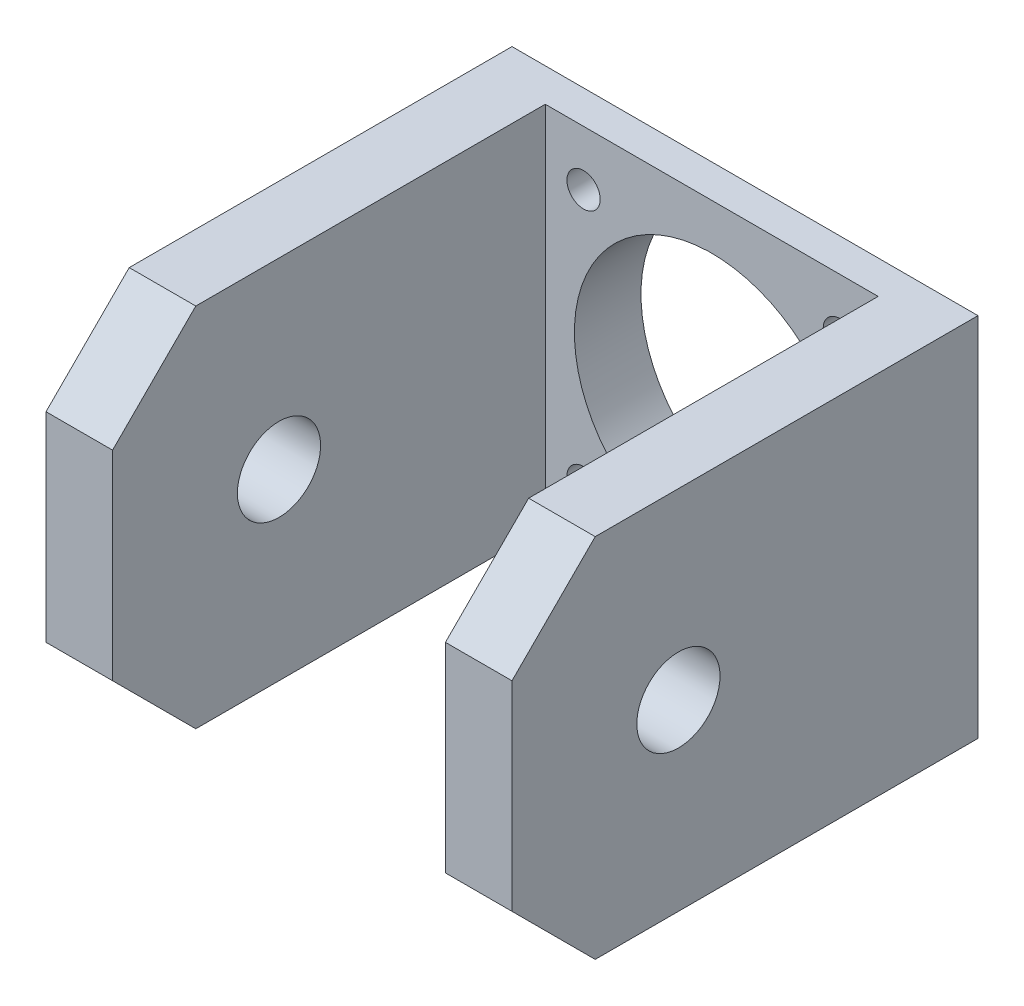
ISO-10303-21;
HEADER;
FILE_DESCRIPTION(('STEP AP214'),'2;1');
FILE_NAME('part.step','',(''),(''),'','','');
FILE_SCHEMA(('AUTOMOTIVE_DESIGN { 1 0 10303 214 1 1 1 1 }'));
ENDSEC;
DATA;
#1=APPLICATION_CONTEXT('core data for automotive mechanical design processes');
#2=APPLICATION_PROTOCOL_DEFINITION('international standard','automotive_design',2000,#1);
#3=PRODUCT_CONTEXT('',#1,'mechanical');
#4=PRODUCT('Part','Part','',(#3));
#5=PRODUCT_RELATED_PRODUCT_CATEGORY('part','',(#4));
#6=PRODUCT_DEFINITION_FORMATION('','',#4);
#7=PRODUCT_DEFINITION_CONTEXT('part definition',#1,'design');
#8=PRODUCT_DEFINITION('design','',#6,#7);
#9=PRODUCT_DEFINITION_SHAPE('','',#8);
#10=(LENGTH_UNIT() NAMED_UNIT(*) SI_UNIT(.MILLI.,.METRE.));
#11=(NAMED_UNIT(*) PLANE_ANGLE_UNIT() SI_UNIT($,.RADIAN.));
#12=(NAMED_UNIT(*) SI_UNIT($,.STERADIAN.) SOLID_ANGLE_UNIT());
#13=UNCERTAINTY_MEASURE_WITH_UNIT(LENGTH_MEASURE(1.E-05),#10,'distance_accuracy_value','');
#14=(GEOMETRIC_REPRESENTATION_CONTEXT(3) GLOBAL_UNCERTAINTY_ASSIGNED_CONTEXT((#13)) GLOBAL_UNIT_ASSIGNED_CONTEXT((#10,
#11,#12)) REPRESENTATION_CONTEXT('',''));
#15=CARTESIAN_POINT('',(0.,0.,0.));
#16=DIRECTION('',(0.,0.,1.));
#17=DIRECTION('',(1.,0.,0.));
#18=AXIS2_PLACEMENT_3D('',#15,#16,#17);
#19=CARTESIAN_POINT('',(4.,0.,0.));
#20=DIRECTION('',(0.,0.,-1.));
#21=DIRECTION('',(-1.,0.,0.));
#22=AXIS2_PLACEMENT_3D('',#19,#20,#21);
#23=PLANE('',#22);
#24=DIRECTION('',(0.,-1.,0.));
#25=VECTOR('',#24,1.);
#26=CARTESIAN_POINT('',(0.,0.,0.));
#27=LINE('',#26,#25);
#28=CARTESIAN_POINT('',(0.,17.,0.));
#29=VERTEX_POINT('',#28);
#30=CARTESIAN_POINT('',(0.,5.00000000000002,0.));
#31=VERTEX_POINT('',#30);
#32=EDGE_CURVE('E171',#29,#31,#27,.T.);
#33=ORIENTED_EDGE('',*,*,#32,.T.);
#34=DIRECTION('',(1.,0.,0.));
#35=VECTOR('',#34,1.);
#36=CARTESIAN_POINT('',(4.,5.00000000000002,0.));
#37=LINE('',#36,#35);
#38=CARTESIAN_POINT('',(4.,5.00000000000002,0.));
#39=VERTEX_POINT('',#38);
#40=EDGE_CURVE('E198',#31,#39,#37,.T.);
#41=ORIENTED_EDGE('',*,*,#40,.T.);
#42=DIRECTION('',(0.,-1.,0.));
#43=VECTOR('',#42,1.);
#44=CARTESIAN_POINT('',(4.,0.,0.));
#45=LINE('',#44,#43);
#46=CARTESIAN_POINT('',(4.,17.,0.));
#47=VERTEX_POINT('',#46);
#48=EDGE_CURVE('E172',#47,#39,#45,.T.);
#49=ORIENTED_EDGE('',*,*,#48,.F.);
#50=DIRECTION('',(-1.,0.,0.));
#51=VECTOR('',#50,1.);
#52=CARTESIAN_POINT('',(4.,17.,0.));
#53=LINE('',#52,#51);
#54=EDGE_CURVE('E195',#47,#29,#53,.T.);
#55=ORIENTED_EDGE('',*,*,#54,.T.);
#56=EDGE_LOOP('',(#33,#41,#49,#55));
#57=FACE_BOUND('',#56,.T.);
#58=ADVANCED_FACE('F34',(#57),#23,.F.);
#59=CARTESIAN_POINT('',(4.,0.,0.));
#60=DIRECTION('',(0.,1.,0.));
#61=DIRECTION('',(0.,0.,1.));
#62=AXIS2_PLACEMENT_3D('',#59,#60,#61);
#63=PLANE('',#62);
#64=DIRECTION('',(0.,0.,1.));
#65=VECTOR('',#64,1.);
#66=CARTESIAN_POINT('',(-24.,0.,-30.));
#67=LINE('',#66,#65);
#68=CARTESIAN_POINT('',(-24.,0.,-28.));
#69=VERTEX_POINT('',#68);
#70=CARTESIAN_POINT('',(-24.,0.,-5.00000000000002));
#71=VERTEX_POINT('',#70);
#72=EDGE_CURVE('E276',#69,#71,#67,.T.);
#73=ORIENTED_EDGE('',*,*,#72,.F.);
#74=DIRECTION('',(1.,0.,0.));
#75=VECTOR('',#74,1.);
#76=CARTESIAN_POINT('',(4.,0.,-28.));
#77=LINE('',#76,#75);
#78=CARTESIAN_POINT('',(4.,0.,-28.));
#79=VERTEX_POINT('',#78);
#80=EDGE_CURVE('E230',#69,#79,#77,.T.);
#81=ORIENTED_EDGE('',*,*,#80,.T.);
#82=DIRECTION('',(0.,0.,-1.));
#83=VECTOR('',#82,1.);
#84=CARTESIAN_POINT('',(4.,0.,0.));
#85=LINE('',#84,#83);
#86=CARTESIAN_POINT('',(4.,0.,-5.));
#87=VERTEX_POINT('',#86);
#88=EDGE_CURVE('E175',#87,#79,#85,.T.);
#89=ORIENTED_EDGE('',*,*,#88,.F.);
#90=DIRECTION('',(-1.,0.,0.));
#91=VECTOR('',#90,1.);
#92=CARTESIAN_POINT('',(4.,0.,-5.));
#93=LINE('',#92,#91);
#94=CARTESIAN_POINT('',(0.,0.,-5.));
#95=VERTEX_POINT('',#94);
#96=EDGE_CURVE('E188',#87,#95,#93,.T.);
#97=ORIENTED_EDGE('',*,*,#96,.T.);
#98=DIRECTION('',(0.,0.,-1.));
#99=VECTOR('',#98,1.);
#100=CARTESIAN_POINT('',(0.,0.,0.));
#101=LINE('',#100,#99);
#102=CARTESIAN_POINT('',(0.,0.,-26.));
#103=VERTEX_POINT('',#102);
#104=EDGE_CURVE('E183',#95,#103,#101,.T.);
#105=ORIENTED_EDGE('',*,*,#104,.T.);
#106=DIRECTION('',(1.,0.,0.));
#107=VECTOR('',#106,1.);
#108=CARTESIAN_POINT('',(-20.,0.,-26.));
#109=LINE('',#108,#107);
#110=CARTESIAN_POINT('',(-20.,0.,-26.));
#111=VERTEX_POINT('',#110);
#112=EDGE_CURVE('E158',#111,#103,#109,.T.);
#113=ORIENTED_EDGE('',*,*,#112,.F.);
#114=DIRECTION('',(0.,0.,1.));
#115=VECTOR('',#114,1.);
#116=CARTESIAN_POINT('',(-20.,0.,-30.));
#117=LINE('',#116,#115);
#118=CARTESIAN_POINT('',(-20.,0.,-5.00000000000002));
#119=VERTEX_POINT('',#118);
#120=EDGE_CURVE('E146',#111,#119,#117,.T.);
#121=ORIENTED_EDGE('',*,*,#120,.T.);
#122=DIRECTION('',(-1.,0.,0.));
#123=VECTOR('',#122,1.);
#124=CARTESIAN_POINT('',(4.,0.,-5.00000000000002));
#125=LINE('',#124,#123);
#126=EDGE_CURVE('E180',#119,#71,#125,.T.);
#127=ORIENTED_EDGE('',*,*,#126,.T.);
#128=EDGE_LOOP('',(#73,#81,#89,#97,#105,#113,#121,#127));
#129=FACE_BOUND('',#128,.T.);
#130=ADVANCED_FACE('F296',(#129),#63,.F.);
#131=CARTESIAN_POINT('',(4.,0.,-30.));
#132=DIRECTION('',(0.,0.,1.));
#133=DIRECTION('',(1.,0.,0.));
#134=AXIS2_PLACEMENT_3D('',#131,#132,#133);
#135=PLANE('',#134);
#136=DIRECTION('',(0.,-1.,0.));
#137=VECTOR('',#136,1.);
#138=CARTESIAN_POINT('',(1.99999999999999,0.,-30.));
#139=LINE('',#138,#137);
#140=CARTESIAN_POINT('',(1.99999999999999,20.,-30.));
#141=VERTEX_POINT('',#140);
#142=CARTESIAN_POINT('',(1.99999999999999,2.00000000000001,-30.));
#143=VERTEX_POINT('',#142);
#144=EDGE_CURVE('E225',#141,#143,#139,.T.);
#145=ORIENTED_EDGE('',*,*,#144,.T.);
#146=DIRECTION('',(-1.,0.,0.));
#147=VECTOR('',#146,1.);
#148=CARTESIAN_POINT('',(4.,2.00000000000001,-30.));
#149=LINE('',#148,#147);
#150=CARTESIAN_POINT('',(-22.,2.00000000000001,-30.));
#151=VERTEX_POINT('',#150);
#152=EDGE_CURVE('E227',#143,#151,#149,.T.);
#153=ORIENTED_EDGE('',*,*,#152,.T.);
#154=DIRECTION('',(0.,1.,0.));
#155=VECTOR('',#154,1.);
#156=CARTESIAN_POINT('',(-22.,22.,-30.));
#157=LINE('',#156,#155);
#158=CARTESIAN_POINT('',(-22.,20.,-30.));
#159=VERTEX_POINT('',#158);
#160=EDGE_CURVE('E221',#151,#159,#157,.T.);
#161=ORIENTED_EDGE('',*,*,#160,.T.);
#162=DIRECTION('',(1.,0.,0.));
#163=VECTOR('',#162,1.);
#164=CARTESIAN_POINT('',(4.,20.,-30.));
#165=LINE('',#164,#163);
#166=EDGE_CURVE('E223',#159,#141,#165,.T.);
#167=ORIENTED_EDGE('',*,*,#166,.T.);
#168=EDGE_LOOP('',(#145,#153,#161,#167));
#169=FACE_BOUND('',#168,.T.);
#170=CARTESIAN_POINT('',(-2.3,3.3,-30.));
#171=DIRECTION('',(0.,0.,-1.));
#172=DIRECTION('',(-1.,0.,0.));
#173=AXIS2_PLACEMENT_3D('',#170,#171,#172);
#174=CIRCLE('',#173,1.);
#175=CARTESIAN_POINT('',(-3.3,3.3,-30.));
#176=VERTEX_POINT('',#175);
#177=EDGE_CURVE('E246',#176,#176,#174,.T.);
#178=ORIENTED_EDGE('',*,*,#177,.F.);
#179=EDGE_LOOP('',(#178));
#180=FACE_BOUND('',#179,.T.);
#181=CARTESIAN_POINT('',(-17.7,3.3,-30.));
#182=DIRECTION('',(0.,0.,-1.));
#183=DIRECTION('',(-1.,0.,0.));
#184=AXIS2_PLACEMENT_3D('',#181,#182,#183);
#185=CIRCLE('',#184,1.);
#186=CARTESIAN_POINT('',(-18.7,3.3,-30.));
#187=VERTEX_POINT('',#186);
#188=EDGE_CURVE('E256',#187,#187,#185,.T.);
#189=ORIENTED_EDGE('',*,*,#188,.F.);
#190=EDGE_LOOP('',(#189));
#191=FACE_BOUND('',#190,.T.);
#192=CARTESIAN_POINT('',(-17.7,18.7,-30.));
#193=DIRECTION('',(0.,0.,-1.));
#194=DIRECTION('',(-1.,0.,0.));
#195=AXIS2_PLACEMENT_3D('',#192,#193,#194);
#196=CIRCLE('',#195,1.);
#197=CARTESIAN_POINT('',(-18.7,18.7,-30.));
#198=VERTEX_POINT('',#197);
#199=EDGE_CURVE('E573',#198,#198,#196,.T.);
#200=ORIENTED_EDGE('',*,*,#199,.F.);
#201=EDGE_LOOP('',(#200));
#202=FACE_BOUND('',#201,.T.);
#203=CARTESIAN_POINT('',(-2.3,18.7,-30.));
#204=DIRECTION('',(0.,0.,-1.));
#205=DIRECTION('',(-1.,0.,0.));
#206=AXIS2_PLACEMENT_3D('',#203,#204,#205);
#207=CIRCLE('',#206,1.);
#208=CARTESIAN_POINT('',(-3.3,18.7,-30.));
#209=VERTEX_POINT('',#208);
#210=EDGE_CURVE('E262',#209,#209,#207,.T.);
#211=ORIENTED_EDGE('',*,*,#210,.F.);
#212=EDGE_LOOP('',(#211));
#213=FACE_BOUND('',#212,.T.);
#214=CARTESIAN_POINT('',(-10.,11.,-30.));
#215=DIRECTION('',(0.,0.,1.));
#216=DIRECTION('',(1.,0.,0.));
#217=AXIS2_PLACEMENT_3D('',#214,#215,#216);
#218=CIRCLE('',#217,8.25);
#219=CARTESIAN_POINT('',(-1.75,11.,-30.));
#220=VERTEX_POINT('',#219);
#221=EDGE_CURVE('E147',#220,#220,#218,.F.);
#222=ORIENTED_EDGE('',*,*,#221,.F.);
#223=EDGE_LOOP('',(#222));
#224=FACE_BOUND('',#223,.T.);
#225=ADVANCED_FACE('F307',(#169,#180,#191,#202,#213,#224),#135,.F.);
#226=CARTESIAN_POINT('',(4.,22.,0.));
#227=DIRECTION('',(0.,-1.,0.));
#228=DIRECTION('',(0.,0.,-1.));
#229=AXIS2_PLACEMENT_3D('',#226,#227,#228);
#230=PLANE('',#229);
#231=DIRECTION('',(0.,0.,1.));
#232=VECTOR('',#231,1.);
#233=CARTESIAN_POINT('',(4.,22.,0.));
#234=LINE('',#233,#232);
#235=CARTESIAN_POINT('',(4.,22.,-28.));
#236=VERTEX_POINT('',#235);
#237=CARTESIAN_POINT('',(4.,22.,-5.00000000000001));
#238=VERTEX_POINT('',#237);
#239=EDGE_CURVE('E178',#236,#238,#234,.T.);
#240=ORIENTED_EDGE('',*,*,#239,.F.);
#241=DIRECTION('',(-1.,0.,0.));
#242=VECTOR('',#241,1.);
#243=CARTESIAN_POINT('',(4.,22.,-28.));
#244=LINE('',#243,#242);
#245=CARTESIAN_POINT('',(-24.,22.,-28.));
#246=VERTEX_POINT('',#245);
#247=EDGE_CURVE('E43',#236,#246,#244,.T.);
#248=ORIENTED_EDGE('',*,*,#247,.T.);
#249=DIRECTION('',(0.,0.,-1.));
#250=VECTOR('',#249,1.);
#251=CARTESIAN_POINT('',(-24.,22.,0.));
#252=LINE('',#251,#250);
#253=CARTESIAN_POINT('',(-24.,22.,-5.));
#254=VERTEX_POINT('',#253);
#255=EDGE_CURVE('E274',#254,#246,#252,.T.);
#256=ORIENTED_EDGE('',*,*,#255,.F.);
#257=DIRECTION('',(1.,0.,0.));
#258=VECTOR('',#257,1.);
#259=CARTESIAN_POINT('',(4.,22.,-5.));
#260=LINE('',#259,#258);
#261=CARTESIAN_POINT('',(-20.,22.,-5.));
#262=VERTEX_POINT('',#261);
#263=EDGE_CURVE('E143',#254,#262,#260,.T.);
#264=ORIENTED_EDGE('',*,*,#263,.T.);
#265=DIRECTION('',(0.,0.,-1.));
#266=VECTOR('',#265,1.);
#267=CARTESIAN_POINT('',(-20.,22.,0.));
#268=LINE('',#267,#266);
#269=CARTESIAN_POINT('',(-20.,22.,-26.));
#270=VERTEX_POINT('',#269);
#271=EDGE_CURVE('E137',#262,#270,#268,.T.);
#272=ORIENTED_EDGE('',*,*,#271,.T.);
#273=DIRECTION('',(1.,0.,0.));
#274=VECTOR('',#273,1.);
#275=CARTESIAN_POINT('',(-20.,22.,-26.));
#276=LINE('',#275,#274);
#277=CARTESIAN_POINT('',(0.,22.,-26.));
#278=VERTEX_POINT('',#277);
#279=EDGE_CURVE('E141',#270,#278,#276,.T.);
#280=ORIENTED_EDGE('',*,*,#279,.T.);
#281=DIRECTION('',(0.,0.,1.));
#282=VECTOR('',#281,1.);
#283=CARTESIAN_POINT('',(0.,22.,0.));
#284=LINE('',#283,#282);
#285=CARTESIAN_POINT('',(0.,22.,-5.00000000000001));
#286=VERTEX_POINT('',#285);
#287=EDGE_CURVE('E176',#278,#286,#284,.T.);
#288=ORIENTED_EDGE('',*,*,#287,.T.);
#289=DIRECTION('',(1.,0.,0.));
#290=VECTOR('',#289,1.);
#291=CARTESIAN_POINT('',(4.,22.,-5.00000000000001));
#292=LINE('',#291,#290);
#293=EDGE_CURVE('E218',#286,#238,#292,.T.);
#294=ORIENTED_EDGE('',*,*,#293,.T.);
#295=EDGE_LOOP('',(#240,#248,#256,#264,#272,#280,#288,#294));
#296=FACE_BOUND('',#295,.T.);
#297=ADVANCED_FACE('F139',(#296),#230,.F.);
#298=CARTESIAN_POINT('',(4.,0.,0.));
#299=DIRECTION('',(-1.,0.,0.));
#300=DIRECTION('',(0.,0.,1.));
#301=AXIS2_PLACEMENT_3D('',#298,#299,#300);
#302=PLANE('',#301);
#303=CARTESIAN_POINT('',(4.,11.,-10.));
#304=DIRECTION('',(1.,0.,0.));
#305=DIRECTION('',(0.,0.,-1.));
#306=AXIS2_PLACEMENT_3D('',#303,#304,#305);
#307=CIRCLE('',#306,2.5);
#308=CARTESIAN_POINT('',(4.,11.,-12.5));
#309=VERTEX_POINT('',#308);
#310=EDGE_CURVE('E601',#309,#309,#307,.T.);
#311=ORIENTED_EDGE('',*,*,#310,.F.);
#312=EDGE_LOOP('',(#311));
#313=FACE_BOUND('',#312,.T.);
#314=ORIENTED_EDGE('',*,*,#88,.T.);
#315=DIRECTION('',(0.,1.,0.));
#316=VECTOR('',#315,1.);
#317=CARTESIAN_POINT('',(4.,0.,-28.));
#318=LINE('',#317,#316);
#319=EDGE_CURVE('E58',#79,#236,#318,.T.);
#320=ORIENTED_EDGE('',*,*,#319,.T.);
#321=ORIENTED_EDGE('',*,*,#239,.T.);
#322=DIRECTION('',(0.,0.707106781186546,-0.707106781186549));
#323=VECTOR('',#322,1.);
#324=CARTESIAN_POINT('',(4.,17.,0.));
#325=LINE('',#324,#323);
#326=EDGE_CURVE('E200',#238,#47,#325,.F.);
#327=ORIENTED_EDGE('',*,*,#326,.T.);
#328=ORIENTED_EDGE('',*,*,#48,.T.);
#329=DIRECTION('',(0.,0.707106781186549,0.707106781186546));
#330=VECTOR('',#329,1.);
#331=CARTESIAN_POINT('',(4.,0.,-5.));
#332=LINE('',#331,#330);
#333=EDGE_CURVE('E202',#39,#87,#332,.F.);
#334=ORIENTED_EDGE('',*,*,#333,.T.);
#335=EDGE_LOOP('',(#314,#320,#321,#327,#328,#334));
#336=FACE_BOUND('',#335,.T.);
#337=ADVANCED_FACE('F385',(#313,#336),#302,.F.);
#338=CARTESIAN_POINT('',(0.,0.,0.));
#339=DIRECTION('',(-1.,0.,0.));
#340=DIRECTION('',(0.,0.,1.));
#341=AXIS2_PLACEMENT_3D('',#338,#339,#340);
#342=PLANE('',#341);
#343=CARTESIAN_POINT('',(0.,11.,-10.));
#344=DIRECTION('',(-1.,0.,0.));
#345=DIRECTION('',(0.,0.,1.));
#346=AXIS2_PLACEMENT_3D('',#343,#344,#345);
#347=CIRCLE('',#346,2.5);
#348=CARTESIAN_POINT('',(0.,11.,-7.5));
#349=VERTEX_POINT('',#348);
#350=EDGE_CURVE('E238',#349,#349,#347,.T.);
#351=ORIENTED_EDGE('',*,*,#350,.F.);
#352=EDGE_LOOP('',(#351));
#353=FACE_BOUND('',#352,.T.);
#354=ORIENTED_EDGE('',*,*,#104,.F.);
#355=DIRECTION('',(0.,-0.707106781186549,-0.707106781186546));
#356=VECTOR('',#355,1.);
#357=CARTESIAN_POINT('',(0.,2.5,-2.50000000000001));
#358=LINE('',#357,#356);
#359=EDGE_CURVE('E193',#95,#31,#358,.F.);
#360=ORIENTED_EDGE('',*,*,#359,.T.);
#361=ORIENTED_EDGE('',*,*,#32,.F.);
#362=DIRECTION('',(0.,-0.707106781186546,0.707106781186549));
#363=VECTOR('',#362,1.);
#364=CARTESIAN_POINT('',(0.,8.50000000000004,8.5));
#365=LINE('',#364,#363);
#366=EDGE_CURVE('E191',#29,#286,#365,.F.);
#367=ORIENTED_EDGE('',*,*,#366,.T.);
#368=ORIENTED_EDGE('',*,*,#287,.F.);
#369=DIRECTION('',(0.,1.,0.));
#370=VECTOR('',#369,1.);
#371=CARTESIAN_POINT('',(0.,22.,-26.));
#372=LINE('',#371,#370);
#373=EDGE_CURVE('E157',#103,#278,#372,.T.);
#374=ORIENTED_EDGE('',*,*,#373,.F.);
#375=EDGE_LOOP('',(#354,#360,#361,#367,#368,#374));
#376=FACE_BOUND('',#375,.T.);
#377=ADVANCED_FACE('F383',(#353,#376),#342,.T.);
#378=CARTESIAN_POINT('',(-20.,22.,-26.));
#379=DIRECTION('',(0.,0.,-1.));
#380=DIRECTION('',(-1.,0.,0.));
#381=AXIS2_PLACEMENT_3D('',#378,#379,#380);
#382=PLANE('',#381);
#383=CARTESIAN_POINT('',(-2.3,3.3,-26.));
#384=DIRECTION('',(0.,0.,-1.));
#385=DIRECTION('',(-1.,0.,0.));
#386=AXIS2_PLACEMENT_3D('',#383,#384,#385);
#387=CIRCLE('',#386,1.);
#388=CARTESIAN_POINT('',(-3.3,3.3,-26.));
#389=VERTEX_POINT('',#388);
#390=EDGE_CURVE('E251',#389,#389,#387,.F.);
#391=ORIENTED_EDGE('',*,*,#390,.F.);
#392=EDGE_LOOP('',(#391));
#393=FACE_BOUND('',#392,.T.);
#394=CARTESIAN_POINT('',(-17.7,3.3,-26.));
#395=DIRECTION('',(0.,0.,-1.));
#396=DIRECTION('',(-1.,0.,0.));
#397=AXIS2_PLACEMENT_3D('',#394,#395,#396);
#398=CIRCLE('',#397,1.);
#399=CARTESIAN_POINT('',(-18.7,3.3,-26.));
#400=VERTEX_POINT('',#399);
#401=EDGE_CURVE('E259',#400,#400,#398,.F.);
#402=ORIENTED_EDGE('',*,*,#401,.F.);
#403=EDGE_LOOP('',(#402));
#404=FACE_BOUND('',#403,.T.);
#405=CARTESIAN_POINT('',(-17.7,18.7,-26.));
#406=DIRECTION('',(0.,0.,-1.));
#407=DIRECTION('',(-1.,0.,0.));
#408=AXIS2_PLACEMENT_3D('',#405,#406,#407);
#409=CIRCLE('',#408,1.);
#410=CARTESIAN_POINT('',(-18.7,18.7,-26.));
#411=VERTEX_POINT('',#410);
#412=EDGE_CURVE('E266',#411,#411,#409,.F.);
#413=ORIENTED_EDGE('',*,*,#412,.F.);
#414=EDGE_LOOP('',(#413));
#415=FACE_BOUND('',#414,.T.);
#416=CARTESIAN_POINT('',(-2.3,18.7,-26.));
#417=DIRECTION('',(0.,0.,-1.));
#418=DIRECTION('',(-1.,0.,0.));
#419=AXIS2_PLACEMENT_3D('',#416,#417,#418);
#420=CIRCLE('',#419,1.);
#421=CARTESIAN_POINT('',(-3.3,18.7,-26.));
#422=VERTEX_POINT('',#421);
#423=EDGE_CURVE('E265',#422,#422,#420,.F.);
#424=ORIENTED_EDGE('',*,*,#423,.F.);
#425=EDGE_LOOP('',(#424));
#426=FACE_BOUND('',#425,.T.);
#427=CARTESIAN_POINT('',(-10.,11.,-26.));
#428=DIRECTION('',(0.,0.,1.));
#429=DIRECTION('',(1.,0.,0.));
#430=AXIS2_PLACEMENT_3D('',#427,#428,#429);
#431=CIRCLE('',#430,8.25);
#432=CARTESIAN_POINT('',(-1.75,11.,-26.));
#433=VERTEX_POINT('',#432);
#434=EDGE_CURVE('E269',#433,#433,#431,.T.);
#435=ORIENTED_EDGE('',*,*,#434,.F.);
#436=EDGE_LOOP('',(#435));
#437=FACE_BOUND('',#436,.T.);
#438=ORIENTED_EDGE('',*,*,#373,.T.);
#439=ORIENTED_EDGE('',*,*,#279,.F.);
#440=DIRECTION('',(0.,1.,0.));
#441=VECTOR('',#440,1.);
#442=CARTESIAN_POINT('',(-20.,22.,-26.));
#443=LINE('',#442,#441);
#444=EDGE_CURVE('E154',#111,#270,#443,.T.);
#445=ORIENTED_EDGE('',*,*,#444,.F.);
#446=ORIENTED_EDGE('',*,*,#112,.T.);
#447=EDGE_LOOP('',(#438,#439,#445,#446));
#448=FACE_BOUND('',#447,.T.);
#449=ADVANCED_FACE('F152',(#393,#404,#415,#426,#437,#448),#382,.F.);
#450=CARTESIAN_POINT('',(-20.,0.,0.));
#451=DIRECTION('',(-1.,0.,0.));
#452=DIRECTION('',(0.,0.,1.));
#453=AXIS2_PLACEMENT_3D('',#450,#451,#452);
#454=PLANE('',#453);
#455=CARTESIAN_POINT('',(-20.,11.,-10.));
#456=DIRECTION('',(-1.,0.,0.));
#457=DIRECTION('',(0.,0.,1.));
#458=AXIS2_PLACEMENT_3D('',#455,#456,#457);
#459=CIRCLE('',#458,2.5);
#460=CARTESIAN_POINT('',(-20.,11.,-7.5));
#461=VERTEX_POINT('',#460);
#462=EDGE_CURVE('E566',#461,#461,#459,.T.);
#463=ORIENTED_EDGE('',*,*,#462,.T.);
#464=EDGE_LOOP('',(#463));
#465=FACE_BOUND('',#464,.T.);
#466=DIRECTION('',(0.,1.,0.));
#467=VECTOR('',#466,1.);
#468=CARTESIAN_POINT('',(-20.,0.,0.));
#469=LINE('',#468,#467);
#470=CARTESIAN_POINT('',(-20.,5.,0.));
#471=VERTEX_POINT('',#470);
#472=CARTESIAN_POINT('',(-20.,17.,0.));
#473=VERTEX_POINT('',#472);
#474=EDGE_CURVE('E167',#471,#473,#469,.T.);
#475=ORIENTED_EDGE('',*,*,#474,.F.);
#476=DIRECTION('',(0.,0.707106781186546,0.707106781186549));
#477=VECTOR('',#476,1.);
#478=CARTESIAN_POINT('',(-20.,5.,0.));
#479=LINE('',#478,#477);
#480=EDGE_CURVE('E211',#471,#119,#479,.F.);
#481=ORIENTED_EDGE('',*,*,#480,.T.);
#482=ORIENTED_EDGE('',*,*,#120,.F.);
#483=ORIENTED_EDGE('',*,*,#444,.T.);
#484=ORIENTED_EDGE('',*,*,#271,.F.);
#485=DIRECTION('',(0.,0.707106781186549,-0.707106781186546));
#486=VECTOR('',#485,1.);
#487=CARTESIAN_POINT('',(-20.,22.,-5.));
#488=LINE('',#487,#486);
#489=EDGE_CURVE('E209',#262,#473,#488,.F.);
#490=ORIENTED_EDGE('',*,*,#489,.T.);
#491=EDGE_LOOP('',(#475,#481,#482,#483,#484,#490));
#492=FACE_BOUND('',#491,.T.);
#493=ADVANCED_FACE('F161',(#465,#492),#454,.F.);
#494=CARTESIAN_POINT('',(-24.,0.,0.));
#495=DIRECTION('',(0.,0.,-1.));
#496=DIRECTION('',(-1.,0.,0.));
#497=AXIS2_PLACEMENT_3D('',#494,#495,#496);
#498=PLANE('',#497);
#499=DIRECTION('',(0.,1.,0.));
#500=VECTOR('',#499,1.);
#501=CARTESIAN_POINT('',(-24.,0.,0.));
#502=LINE('',#501,#500);
#503=CARTESIAN_POINT('',(-24.,5.,0.));
#504=VERTEX_POINT('',#503);
#505=CARTESIAN_POINT('',(-24.,17.,0.));
#506=VERTEX_POINT('',#505);
#507=EDGE_CURVE('E164',#504,#506,#502,.T.);
#508=ORIENTED_EDGE('',*,*,#507,.F.);
#509=DIRECTION('',(1.,0.,0.));
#510=VECTOR('',#509,1.);
#511=CARTESIAN_POINT('',(-24.,5.,0.));
#512=LINE('',#511,#510);
#513=EDGE_CURVE('E206',#504,#471,#512,.T.);
#514=ORIENTED_EDGE('',*,*,#513,.T.);
#515=ORIENTED_EDGE('',*,*,#474,.T.);
#516=DIRECTION('',(-1.,0.,0.));
#517=VECTOR('',#516,1.);
#518=CARTESIAN_POINT('',(-24.,17.,0.));
#519=LINE('',#518,#517);
#520=EDGE_CURVE('E204',#473,#506,#519,.T.);
#521=ORIENTED_EDGE('',*,*,#520,.T.);
#522=EDGE_LOOP('',(#508,#514,#515,#521));
#523=FACE_BOUND('',#522,.T.);
#524=ADVANCED_FACE('F285',(#523),#498,.F.);
#525=CARTESIAN_POINT('',(-24.,0.,0.));
#526=DIRECTION('',(-1.,0.,0.));
#527=DIRECTION('',(0.,0.,1.));
#528=AXIS2_PLACEMENT_3D('',#525,#526,#527);
#529=PLANE('',#528);
#530=CARTESIAN_POINT('',(-24.,11.,-10.));
#531=DIRECTION('',(-1.,0.,0.));
#532=DIRECTION('',(0.,0.,1.));
#533=AXIS2_PLACEMENT_3D('',#530,#531,#532);
#534=CIRCLE('',#533,2.5);
#535=CARTESIAN_POINT('',(-24.,11.,-7.5));
#536=VERTEX_POINT('',#535);
#537=EDGE_CURVE('E569',#536,#536,#534,.F.);
#538=ORIENTED_EDGE('',*,*,#537,.T.);
#539=EDGE_LOOP('',(#538));
#540=FACE_BOUND('',#539,.T.);
#541=ORIENTED_EDGE('',*,*,#255,.T.);
#542=DIRECTION('',(0.,-1.,0.));
#543=VECTOR('',#542,1.);
#544=CARTESIAN_POINT('',(-24.,0.,-28.));
#545=LINE('',#544,#543);
#546=EDGE_CURVE('E11',#246,#69,#545,.T.);
#547=ORIENTED_EDGE('',*,*,#546,.T.);
#548=ORIENTED_EDGE('',*,*,#72,.T.);
#549=DIRECTION('',(0.,-0.707106781186546,-0.707106781186549));
#550=VECTOR('',#549,1.);
#551=CARTESIAN_POINT('',(-24.,2.50000000000001,-2.5));
#552=LINE('',#551,#550);
#553=EDGE_CURVE('E215',#71,#504,#552,.F.);
#554=ORIENTED_EDGE('',*,*,#553,.T.);
#555=ORIENTED_EDGE('',*,*,#507,.T.);
#556=DIRECTION('',(0.,-0.707106781186549,0.707106781186546));
#557=VECTOR('',#556,1.);
#558=CARTESIAN_POINT('',(-24.,8.49999999999995,8.49999999999999));
#559=LINE('',#558,#557);
#560=EDGE_CURVE('E213',#506,#254,#559,.F.);
#561=ORIENTED_EDGE('',*,*,#560,.T.);
#562=EDGE_LOOP('',(#541,#547,#548,#554,#555,#561));
#563=FACE_BOUND('',#562,.T.);
#564=ADVANCED_FACE('F291',(#540,#563),#529,.T.);
#565=CARTESIAN_POINT('',(4.,0.,-5.));
#566=DIRECTION('',(0.,0.707106781186546,-0.707106781186549));
#567=DIRECTION('',(-1.,0.,0.));
#568=AXIS2_PLACEMENT_3D('',#565,#566,#567);
#569=PLANE('',#568);
#570=ORIENTED_EDGE('',*,*,#333,.F.);
#571=ORIENTED_EDGE('',*,*,#40,.F.);
#572=ORIENTED_EDGE('',*,*,#359,.F.);
#573=ORIENTED_EDGE('',*,*,#96,.F.);
#574=EDGE_LOOP('',(#570,#571,#572,#573));
#575=FACE_BOUND('',#574,.T.);
#576=ADVANCED_FACE('F327',(#575),#569,.F.);
#577=CARTESIAN_POINT('',(-24.,5.,0.));
#578=DIRECTION('',(0.,0.707106781186549,-0.707106781186546));
#579=DIRECTION('',(1.,0.,0.));
#580=AXIS2_PLACEMENT_3D('',#577,#578,#579);
#581=PLANE('',#580);
#582=ORIENTED_EDGE('',*,*,#553,.F.);
#583=ORIENTED_EDGE('',*,*,#126,.F.);
#584=ORIENTED_EDGE('',*,*,#480,.F.);
#585=ORIENTED_EDGE('',*,*,#513,.F.);
#586=EDGE_LOOP('',(#582,#583,#584,#585));
#587=FACE_BOUND('',#586,.T.);
#588=ADVANCED_FACE('F294',(#587),#581,.F.);
#589=CARTESIAN_POINT('',(4.,17.,0.));
#590=DIRECTION('',(0.,-0.707106781186549,-0.707106781186546));
#591=DIRECTION('',(-1.,0.,0.));
#592=AXIS2_PLACEMENT_3D('',#589,#590,#591);
#593=PLANE('',#592);
#594=ORIENTED_EDGE('',*,*,#326,.F.);
#595=ORIENTED_EDGE('',*,*,#293,.F.);
#596=ORIENTED_EDGE('',*,*,#366,.F.);
#597=ORIENTED_EDGE('',*,*,#54,.F.);
#598=EDGE_LOOP('',(#594,#595,#596,#597));
#599=FACE_BOUND('',#598,.T.);
#600=ADVANCED_FACE('F333',(#599),#593,.F.);
#601=CARTESIAN_POINT('',(4.,22.,-5.));
#602=DIRECTION('',(0.,-0.707106781186546,-0.707106781186549));
#603=DIRECTION('',(1.,0.,0.));
#604=AXIS2_PLACEMENT_3D('',#601,#602,#603);
#605=PLANE('',#604);
#606=ORIENTED_EDGE('',*,*,#560,.F.);
#607=ORIENTED_EDGE('',*,*,#520,.F.);
#608=ORIENTED_EDGE('',*,*,#489,.F.);
#609=ORIENTED_EDGE('',*,*,#263,.F.);
#610=EDGE_LOOP('',(#606,#607,#608,#609));
#611=FACE_BOUND('',#610,.T.);
#612=ADVANCED_FACE('F289',(#611),#605,.F.);
#613=CARTESIAN_POINT('',(-10.,11.,-53.3345237791561));
#614=DIRECTION('',(0.,0.,1.));
#615=DIRECTION('',(1.,0.,0.));
#616=AXIS2_PLACEMENT_3D('',#613,#614,#615);
#617=CYLINDRICAL_SURFACE('',#616,8.25);
#618=ORIENTED_EDGE('',*,*,#221,.T.);
#619=EDGE_LOOP('',(#618));
#620=FACE_BOUND('',#619,.T.);
#621=ORIENTED_EDGE('',*,*,#434,.T.);
#622=EDGE_LOOP('',(#621));
#623=FACE_BOUND('',#622,.T.);
#624=ADVANCED_FACE('F339',(#620,#623),#617,.F.);
#625=CARTESIAN_POINT('',(-2.3,18.7,-23.1715728752538));
#626=DIRECTION('',(0.,0.,-1.));
#627=DIRECTION('',(-1.,0.,0.));
#628=AXIS2_PLACEMENT_3D('',#625,#626,#627);
#629=CYLINDRICAL_SURFACE('',#628,1.);
#630=CARTESIAN_POINT('',(-3.3,18.7,-26.));
#631=CARTESIAN_POINT('',(-3.3,18.7,-26.0416666666667));
#632=CARTESIAN_POINT('',(-3.3,18.7,-26.0833333333333));
#633=CARTESIAN_POINT('',(-3.3,18.7,-26.1666666666667));
#634=CARTESIAN_POINT('',(-3.3,18.7,-26.2083333333333));
#635=CARTESIAN_POINT('',(-3.3,18.7,-26.2916666666667));
#636=CARTESIAN_POINT('',(-3.3,18.7,-26.3333333333333));
#637=CARTESIAN_POINT('',(-3.3,18.7,-26.4166666666667));
#638=CARTESIAN_POINT('',(-3.3,18.7,-26.4583333333333));
#639=CARTESIAN_POINT('',(-3.3,18.7,-26.5416666666667));
#640=CARTESIAN_POINT('',(-3.3,18.7,-26.5833333333333));
#641=CARTESIAN_POINT('',(-3.3,18.7,-26.6666666666667));
#642=CARTESIAN_POINT('',(-3.3,18.7,-26.7083333333333));
#643=CARTESIAN_POINT('',(-3.3,18.7,-26.7916666666667));
#644=CARTESIAN_POINT('',(-3.3,18.7,-26.8333333333333));
#645=CARTESIAN_POINT('',(-3.3,18.7,-26.9166666666667));
#646=CARTESIAN_POINT('',(-3.3,18.7,-26.9583333333333));
#647=CARTESIAN_POINT('',(-3.3,18.7,-27.0416666666667));
#648=CARTESIAN_POINT('',(-3.3,18.7,-27.0833333333333));
#649=CARTESIAN_POINT('',(-3.3,18.7,-27.1666666666667));
#650=CARTESIAN_POINT('',(-3.3,18.7,-27.2083333333333));
#651=CARTESIAN_POINT('',(-3.3,18.7,-27.2916666666667));
#652=CARTESIAN_POINT('',(-3.3,18.7,-27.3333333333333));
#653=CARTESIAN_POINT('',(-3.3,18.7,-27.4166666666667));
#654=CARTESIAN_POINT('',(-3.3,18.7,-27.4583333333333));
#655=CARTESIAN_POINT('',(-3.3,18.7,-27.5416666666667));
#656=CARTESIAN_POINT('',(-3.3,18.7,-27.5833333333333));
#657=CARTESIAN_POINT('',(-3.3,18.7,-27.6666666666667));
#658=CARTESIAN_POINT('',(-3.3,18.7,-27.7083333333333));
#659=CARTESIAN_POINT('',(-3.3,18.7,-27.7916666666667));
#660=CARTESIAN_POINT('',(-3.3,18.7,-27.8333333333333));
#661=CARTESIAN_POINT('',(-3.3,18.7,-27.9166666666667));
#662=CARTESIAN_POINT('',(-3.3,18.7,-27.9583333333333));
#663=CARTESIAN_POINT('',(-3.3,18.7,-28.0416666666667));
#664=CARTESIAN_POINT('',(-3.3,18.7,-28.0833333333333));
#665=CARTESIAN_POINT('',(-3.3,18.7,-28.1666666666667));
#666=CARTESIAN_POINT('',(-3.3,18.7,-28.2083333333333));
#667=CARTESIAN_POINT('',(-3.3,18.7,-28.2916666666667));
#668=CARTESIAN_POINT('',(-3.3,18.7,-28.3333333333333));
#669=CARTESIAN_POINT('',(-3.3,18.7,-28.4166666666667));
#670=CARTESIAN_POINT('',(-3.3,18.7,-28.4583333333333));
#671=CARTESIAN_POINT('',(-3.3,18.7,-28.5416666666667));
#672=CARTESIAN_POINT('',(-3.3,18.7,-28.5833333333333));
#673=CARTESIAN_POINT('',(-3.3,18.7,-28.6666666666667));
#674=CARTESIAN_POINT('',(-3.3,18.7,-28.7083333333333));
#675=CARTESIAN_POINT('',(-3.3,18.7,-28.7916666666667));
#676=CARTESIAN_POINT('',(-3.3,18.7,-28.8333333333333));
#677=CARTESIAN_POINT('',(-3.3,18.7,-28.9166666666667));
#678=CARTESIAN_POINT('',(-3.3,18.7,-28.9583333333333));
#679=CARTESIAN_POINT('',(-3.3,18.7,-29.0416666666667));
#680=CARTESIAN_POINT('',(-3.3,18.7,-29.0833333333333));
#681=CARTESIAN_POINT('',(-3.3,18.7,-29.1666666666667));
#682=CARTESIAN_POINT('',(-3.3,18.7,-29.2083333333333));
#683=CARTESIAN_POINT('',(-3.3,18.7,-29.2916666666667));
#684=CARTESIAN_POINT('',(-3.3,18.7,-29.3333333333333));
#685=CARTESIAN_POINT('',(-3.3,18.7,-29.4166666666667));
#686=CARTESIAN_POINT('',(-3.3,18.7,-29.4583333333333));
#687=CARTESIAN_POINT('',(-3.3,18.7,-29.5416666666667));
#688=CARTESIAN_POINT('',(-3.3,18.7,-29.5833333333333));
#689=CARTESIAN_POINT('',(-3.3,18.7,-29.6666666666667));
#690=CARTESIAN_POINT('',(-3.3,18.7,-29.7083333333333));
#691=CARTESIAN_POINT('',(-3.3,18.7,-29.7916666666667));
#692=CARTESIAN_POINT('',(-3.3,18.7,-29.8333333333333));
#693=CARTESIAN_POINT('',(-3.3,18.7,-29.9166666666667));
#694=CARTESIAN_POINT('',(-3.3,18.7,-29.9583333333333));
#695=CARTESIAN_POINT('',(-3.3,18.7,-30.));
#696=B_SPLINE_CURVE_WITH_KNOTS('',3,(#630,#631,#632,#633,#634,#635,#636,#637,#638,#639,#640,
#641,#642,#643,#644,#645,#646,#647,#648,#649,#650,#651,#652,#653,#654,#655,#656,#657,#658,#659,
#660,#661,#662,#663,#664,#665,#666,#667,#668,#669,#670,#671,#672,#673,#674,#675,#676,#677,#678,
#679,#680,#681,#682,#683,#684,#685,#686,#687,#688,#689,#690,#691,#692,#693,#694,#695),
.UNSPECIFIED.,.F.,.F.,(4,2,2,2,2,2,2,2,2,2,2,2,2,2,2,2,2,2,2,2,2,2,2,2,2,2,2,2,2,2,2,2,4),(0.,
0.125,0.249999999999997,0.374999999999997,0.499999999999997,0.624999999999997,0.749999999999997,
0.874999999999997,0.999999999999997,1.125,1.25,1.375,1.5,1.625,1.75,1.875,2.,2.125,2.25,2.375,
2.5,2.625,2.75,2.875,3.,3.125,3.25,3.375,3.5,3.625,3.75,3.875,4.),.UNSPECIFIED.);
#697=EDGE_CURVE('BSEAM359',#422,#209,#696,.T.);
#698=ORIENTED_EDGE('',*,*,#423,.T.);
#699=ORIENTED_EDGE('',*,*,#210,.T.);
#700=ORIENTED_EDGE('',*,*,#697,.T.);
#701=ORIENTED_EDGE('',*,*,#697,.F.);
#702=EDGE_LOOP('',(#698,#700,#699,#701));
#703=FACE_BOUND('',#702,.T.);
#704=ADVANCED_FACE('F359',(#703),#629,.F.);
#705=CARTESIAN_POINT('',(-17.7,18.7,-23.1715728752538));
#706=DIRECTION('',(0.,0.,-1.));
#707=DIRECTION('',(-1.,0.,0.));
#708=AXIS2_PLACEMENT_3D('',#705,#706,#707);
#709=CYLINDRICAL_SURFACE('',#708,1.);
#710=CARTESIAN_POINT('',(-18.7,18.7,-26.));
#711=CARTESIAN_POINT('',(-18.7,18.7,-26.0416666666667));
#712=CARTESIAN_POINT('',(-18.7,18.7,-26.0833333333333));
#713=CARTESIAN_POINT('',(-18.7,18.7,-26.1666666666667));
#714=CARTESIAN_POINT('',(-18.7,18.7,-26.2083333333333));
#715=CARTESIAN_POINT('',(-18.7,18.7,-26.2916666666667));
#716=CARTESIAN_POINT('',(-18.7,18.7,-26.3333333333333));
#717=CARTESIAN_POINT('',(-18.7,18.7,-26.4166666666667));
#718=CARTESIAN_POINT('',(-18.7,18.7,-26.4583333333333));
#719=CARTESIAN_POINT('',(-18.7,18.7,-26.5416666666667));
#720=CARTESIAN_POINT('',(-18.7,18.7,-26.5833333333333));
#721=CARTESIAN_POINT('',(-18.7,18.7,-26.6666666666667));
#722=CARTESIAN_POINT('',(-18.7,18.7,-26.7083333333333));
#723=CARTESIAN_POINT('',(-18.7,18.7,-26.7916666666667));
#724=CARTESIAN_POINT('',(-18.7,18.7,-26.8333333333333));
#725=CARTESIAN_POINT('',(-18.7,18.7,-26.9166666666667));
#726=CARTESIAN_POINT('',(-18.7,18.7,-26.9583333333333));
#727=CARTESIAN_POINT('',(-18.7,18.7,-27.0416666666667));
#728=CARTESIAN_POINT('',(-18.7,18.7,-27.0833333333333));
#729=CARTESIAN_POINT('',(-18.7,18.7,-27.1666666666667));
#730=CARTESIAN_POINT('',(-18.7,18.7,-27.2083333333333));
#731=CARTESIAN_POINT('',(-18.7,18.7,-27.2916666666667));
#732=CARTESIAN_POINT('',(-18.7,18.7,-27.3333333333333));
#733=CARTESIAN_POINT('',(-18.7,18.7,-27.4166666666667));
#734=CARTESIAN_POINT('',(-18.7,18.7,-27.4583333333333));
#735=CARTESIAN_POINT('',(-18.7,18.7,-27.5416666666667));
#736=CARTESIAN_POINT('',(-18.7,18.7,-27.5833333333333));
#737=CARTESIAN_POINT('',(-18.7,18.7,-27.6666666666667));
#738=CARTESIAN_POINT('',(-18.7,18.7,-27.7083333333333));
#739=CARTESIAN_POINT('',(-18.7,18.7,-27.7916666666667));
#740=CARTESIAN_POINT('',(-18.7,18.7,-27.8333333333333));
#741=CARTESIAN_POINT('',(-18.7,18.7,-27.9166666666667));
#742=CARTESIAN_POINT('',(-18.7,18.7,-27.9583333333333));
#743=CARTESIAN_POINT('',(-18.7,18.7,-28.0416666666667));
#744=CARTESIAN_POINT('',(-18.7,18.7,-28.0833333333333));
#745=CARTESIAN_POINT('',(-18.7,18.7,-28.1666666666667));
#746=CARTESIAN_POINT('',(-18.7,18.7,-28.2083333333333));
#747=CARTESIAN_POINT('',(-18.7,18.7,-28.2916666666667));
#748=CARTESIAN_POINT('',(-18.7,18.7,-28.3333333333333));
#749=CARTESIAN_POINT('',(-18.7,18.7,-28.4166666666667));
#750=CARTESIAN_POINT('',(-18.7,18.7,-28.4583333333333));
#751=CARTESIAN_POINT('',(-18.7,18.7,-28.5416666666667));
#752=CARTESIAN_POINT('',(-18.7,18.7,-28.5833333333333));
#753=CARTESIAN_POINT('',(-18.7,18.7,-28.6666666666667));
#754=CARTESIAN_POINT('',(-18.7,18.7,-28.7083333333333));
#755=CARTESIAN_POINT('',(-18.7,18.7,-28.7916666666667));
#756=CARTESIAN_POINT('',(-18.7,18.7,-28.8333333333333));
#757=CARTESIAN_POINT('',(-18.7,18.7,-28.9166666666667));
#758=CARTESIAN_POINT('',(-18.7,18.7,-28.9583333333333));
#759=CARTESIAN_POINT('',(-18.7,18.7,-29.0416666666667));
#760=CARTESIAN_POINT('',(-18.7,18.7,-29.0833333333333));
#761=CARTESIAN_POINT('',(-18.7,18.7,-29.1666666666667));
#762=CARTESIAN_POINT('',(-18.7,18.7,-29.2083333333333));
#763=CARTESIAN_POINT('',(-18.7,18.7,-29.2916666666667));
#764=CARTESIAN_POINT('',(-18.7,18.7,-29.3333333333333));
#765=CARTESIAN_POINT('',(-18.7,18.7,-29.4166666666667));
#766=CARTESIAN_POINT('',(-18.7,18.7,-29.4583333333333));
#767=CARTESIAN_POINT('',(-18.7,18.7,-29.5416666666667));
#768=CARTESIAN_POINT('',(-18.7,18.7,-29.5833333333333));
#769=CARTESIAN_POINT('',(-18.7,18.7,-29.6666666666667));
#770=CARTESIAN_POINT('',(-18.7,18.7,-29.7083333333333));
#771=CARTESIAN_POINT('',(-18.7,18.7,-29.7916666666667));
#772=CARTESIAN_POINT('',(-18.7,18.7,-29.8333333333333));
#773=CARTESIAN_POINT('',(-18.7,18.7,-29.9166666666667));
#774=CARTESIAN_POINT('',(-18.7,18.7,-29.9583333333333));
#775=CARTESIAN_POINT('',(-18.7,18.7,-30.));
#776=B_SPLINE_CURVE_WITH_KNOTS('',3,(#710,#711,#712,#713,#714,#715,#716,#717,#718,#719,#720,
#721,#722,#723,#724,#725,#726,#727,#728,#729,#730,#731,#732,#733,#734,#735,#736,#737,#738,#739,
#740,#741,#742,#743,#744,#745,#746,#747,#748,#749,#750,#751,#752,#753,#754,#755,#756,#757,#758,
#759,#760,#761,#762,#763,#764,#765,#766,#767,#768,#769,#770,#771,#772,#773,#774,#775),
.UNSPECIFIED.,.F.,.F.,(4,2,2,2,2,2,2,2,2,2,2,2,2,2,2,2,2,2,2,2,2,2,2,2,2,2,2,2,2,2,2,2,4),(0.,
0.125,0.249999999999997,0.374999999999997,0.499999999999997,0.624999999999997,0.749999999999997,
0.874999999999997,0.999999999999997,1.125,1.25,1.375,1.5,1.625,1.75,1.875,2.,2.125,2.25,2.375,
2.5,2.625,2.75,2.875,3.,3.125,3.25,3.375,3.5,3.625,3.75,3.875,4.),.UNSPECIFIED.);
#777=EDGE_CURVE('BSEAM355',#411,#198,#776,.T.);
#778=ORIENTED_EDGE('',*,*,#412,.T.);
#779=ORIENTED_EDGE('',*,*,#199,.T.);
#780=ORIENTED_EDGE('',*,*,#777,.T.);
#781=ORIENTED_EDGE('',*,*,#777,.F.);
#782=EDGE_LOOP('',(#778,#780,#779,#781));
#783=FACE_BOUND('',#782,.T.);
#784=ADVANCED_FACE('F355',(#783),#709,.F.);
#785=CARTESIAN_POINT('',(-17.7,3.3,-23.1715728752538));
#786=DIRECTION('',(0.,0.,-1.));
#787=DIRECTION('',(-1.,0.,0.));
#788=AXIS2_PLACEMENT_3D('',#785,#786,#787);
#789=CYLINDRICAL_SURFACE('',#788,1.);
#790=CARTESIAN_POINT('',(-18.7,3.3,-26.));
#791=CARTESIAN_POINT('',(-18.7,3.3,-26.0416666666667));
#792=CARTESIAN_POINT('',(-18.7,3.3,-26.0833333333333));
#793=CARTESIAN_POINT('',(-18.7,3.3,-26.1666666666667));
#794=CARTESIAN_POINT('',(-18.7,3.3,-26.2083333333333));
#795=CARTESIAN_POINT('',(-18.7,3.3,-26.2916666666667));
#796=CARTESIAN_POINT('',(-18.7,3.3,-26.3333333333333));
#797=CARTESIAN_POINT('',(-18.7,3.3,-26.4166666666667));
#798=CARTESIAN_POINT('',(-18.7,3.3,-26.4583333333333));
#799=CARTESIAN_POINT('',(-18.7,3.3,-26.5416666666667));
#800=CARTESIAN_POINT('',(-18.7,3.3,-26.5833333333333));
#801=CARTESIAN_POINT('',(-18.7,3.3,-26.6666666666667));
#802=CARTESIAN_POINT('',(-18.7,3.3,-26.7083333333333));
#803=CARTESIAN_POINT('',(-18.7,3.3,-26.7916666666667));
#804=CARTESIAN_POINT('',(-18.7,3.3,-26.8333333333333));
#805=CARTESIAN_POINT('',(-18.7,3.3,-26.9166666666667));
#806=CARTESIAN_POINT('',(-18.7,3.3,-26.9583333333333));
#807=CARTESIAN_POINT('',(-18.7,3.3,-27.0416666666667));
#808=CARTESIAN_POINT('',(-18.7,3.3,-27.0833333333333));
#809=CARTESIAN_POINT('',(-18.7,3.3,-27.1666666666667));
#810=CARTESIAN_POINT('',(-18.7,3.3,-27.2083333333333));
#811=CARTESIAN_POINT('',(-18.7,3.3,-27.2916666666667));
#812=CARTESIAN_POINT('',(-18.7,3.3,-27.3333333333333));
#813=CARTESIAN_POINT('',(-18.7,3.3,-27.4166666666667));
#814=CARTESIAN_POINT('',(-18.7,3.3,-27.4583333333333));
#815=CARTESIAN_POINT('',(-18.7,3.3,-27.5416666666667));
#816=CARTESIAN_POINT('',(-18.7,3.3,-27.5833333333333));
#817=CARTESIAN_POINT('',(-18.7,3.3,-27.6666666666667));
#818=CARTESIAN_POINT('',(-18.7,3.3,-27.7083333333333));
#819=CARTESIAN_POINT('',(-18.7,3.3,-27.7916666666667));
#820=CARTESIAN_POINT('',(-18.7,3.3,-27.8333333333333));
#821=CARTESIAN_POINT('',(-18.7,3.3,-27.9166666666667));
#822=CARTESIAN_POINT('',(-18.7,3.3,-27.9583333333333));
#823=CARTESIAN_POINT('',(-18.7,3.3,-28.0416666666667));
#824=CARTESIAN_POINT('',(-18.7,3.3,-28.0833333333333));
#825=CARTESIAN_POINT('',(-18.7,3.3,-28.1666666666667));
#826=CARTESIAN_POINT('',(-18.7,3.3,-28.2083333333333));
#827=CARTESIAN_POINT('',(-18.7,3.3,-28.2916666666667));
#828=CARTESIAN_POINT('',(-18.7,3.3,-28.3333333333333));
#829=CARTESIAN_POINT('',(-18.7,3.3,-28.4166666666667));
#830=CARTESIAN_POINT('',(-18.7,3.3,-28.4583333333333));
#831=CARTESIAN_POINT('',(-18.7,3.3,-28.5416666666667));
#832=CARTESIAN_POINT('',(-18.7,3.3,-28.5833333333333));
#833=CARTESIAN_POINT('',(-18.7,3.3,-28.6666666666667));
#834=CARTESIAN_POINT('',(-18.7,3.3,-28.7083333333333));
#835=CARTESIAN_POINT('',(-18.7,3.3,-28.7916666666667));
#836=CARTESIAN_POINT('',(-18.7,3.3,-28.8333333333333));
#837=CARTESIAN_POINT('',(-18.7,3.3,-28.9166666666667));
#838=CARTESIAN_POINT('',(-18.7,3.3,-28.9583333333333));
#839=CARTESIAN_POINT('',(-18.7,3.3,-29.0416666666667));
#840=CARTESIAN_POINT('',(-18.7,3.3,-29.0833333333333));
#841=CARTESIAN_POINT('',(-18.7,3.3,-29.1666666666667));
#842=CARTESIAN_POINT('',(-18.7,3.3,-29.2083333333333));
#843=CARTESIAN_POINT('',(-18.7,3.3,-29.2916666666667));
#844=CARTESIAN_POINT('',(-18.7,3.3,-29.3333333333333));
#845=CARTESIAN_POINT('',(-18.7,3.3,-29.4166666666667));
#846=CARTESIAN_POINT('',(-18.7,3.3,-29.4583333333333));
#847=CARTESIAN_POINT('',(-18.7,3.3,-29.5416666666667));
#848=CARTESIAN_POINT('',(-18.7,3.3,-29.5833333333333));
#849=CARTESIAN_POINT('',(-18.7,3.3,-29.6666666666667));
#850=CARTESIAN_POINT('',(-18.7,3.3,-29.7083333333333));
#851=CARTESIAN_POINT('',(-18.7,3.3,-29.7916666666667));
#852=CARTESIAN_POINT('',(-18.7,3.3,-29.8333333333333));
#853=CARTESIAN_POINT('',(-18.7,3.3,-29.9166666666667));
#854=CARTESIAN_POINT('',(-18.7,3.3,-29.9583333333333));
#855=CARTESIAN_POINT('',(-18.7,3.3,-30.));
#856=B_SPLINE_CURVE_WITH_KNOTS('',3,(#790,#791,#792,#793,#794,#795,#796,#797,#798,#799,#800,
#801,#802,#803,#804,#805,#806,#807,#808,#809,#810,#811,#812,#813,#814,#815,#816,#817,#818,#819,
#820,#821,#822,#823,#824,#825,#826,#827,#828,#829,#830,#831,#832,#833,#834,#835,#836,#837,#838,
#839,#840,#841,#842,#843,#844,#845,#846,#847,#848,#849,#850,#851,#852,#853,#854,#855),
.UNSPECIFIED.,.F.,.F.,(4,2,2,2,2,2,2,2,2,2,2,2,2,2,2,2,2,2,2,2,2,2,2,2,2,2,2,2,2,2,2,2,4),(0.,
0.125,0.249999999999997,0.374999999999997,0.499999999999997,0.624999999999997,0.749999999999997,
0.874999999999997,0.999999999999997,1.125,1.25,1.375,1.5,1.625,1.75,1.875,2.,2.125,2.25,2.375,
2.5,2.625,2.75,2.875,3.,3.125,3.25,3.375,3.5,3.625,3.75,3.875,4.),.UNSPECIFIED.);
#857=EDGE_CURVE('BSEAM358',#400,#187,#856,.T.);
#858=ORIENTED_EDGE('',*,*,#401,.T.);
#859=ORIENTED_EDGE('',*,*,#188,.T.);
#860=ORIENTED_EDGE('',*,*,#857,.T.);
#861=ORIENTED_EDGE('',*,*,#857,.F.);
#862=EDGE_LOOP('',(#858,#860,#859,#861));
#863=FACE_BOUND('',#862,.T.);
#864=ADVANCED_FACE('F358',(#863),#789,.F.);
#865=CARTESIAN_POINT('',(-2.3,3.3,-23.1715728752538));
#866=DIRECTION('',(0.,0.,-1.));
#867=DIRECTION('',(-1.,0.,0.));
#868=AXIS2_PLACEMENT_3D('',#865,#866,#867);
#869=CYLINDRICAL_SURFACE('',#868,1.);
#870=CARTESIAN_POINT('',(-3.3,3.3,-26.));
#871=CARTESIAN_POINT('',(-3.3,3.3,-26.0416666666667));
#872=CARTESIAN_POINT('',(-3.3,3.3,-26.0833333333333));
#873=CARTESIAN_POINT('',(-3.3,3.3,-26.1666666666667));
#874=CARTESIAN_POINT('',(-3.3,3.3,-26.2083333333333));
#875=CARTESIAN_POINT('',(-3.3,3.3,-26.2916666666667));
#876=CARTESIAN_POINT('',(-3.3,3.3,-26.3333333333333));
#877=CARTESIAN_POINT('',(-3.3,3.3,-26.4166666666667));
#878=CARTESIAN_POINT('',(-3.3,3.3,-26.4583333333333));
#879=CARTESIAN_POINT('',(-3.3,3.3,-26.5416666666667));
#880=CARTESIAN_POINT('',(-3.3,3.3,-26.5833333333333));
#881=CARTESIAN_POINT('',(-3.3,3.3,-26.6666666666667));
#882=CARTESIAN_POINT('',(-3.3,3.3,-26.7083333333333));
#883=CARTESIAN_POINT('',(-3.3,3.3,-26.7916666666667));
#884=CARTESIAN_POINT('',(-3.3,3.3,-26.8333333333333));
#885=CARTESIAN_POINT('',(-3.3,3.3,-26.9166666666667));
#886=CARTESIAN_POINT('',(-3.3,3.3,-26.9583333333333));
#887=CARTESIAN_POINT('',(-3.3,3.3,-27.0416666666667));
#888=CARTESIAN_POINT('',(-3.3,3.3,-27.0833333333333));
#889=CARTESIAN_POINT('',(-3.3,3.3,-27.1666666666667));
#890=CARTESIAN_POINT('',(-3.3,3.3,-27.2083333333333));
#891=CARTESIAN_POINT('',(-3.3,3.3,-27.2916666666667));
#892=CARTESIAN_POINT('',(-3.3,3.3,-27.3333333333333));
#893=CARTESIAN_POINT('',(-3.3,3.3,-27.4166666666667));
#894=CARTESIAN_POINT('',(-3.3,3.3,-27.4583333333333));
#895=CARTESIAN_POINT('',(-3.3,3.3,-27.5416666666667));
#896=CARTESIAN_POINT('',(-3.3,3.3,-27.5833333333333));
#897=CARTESIAN_POINT('',(-3.3,3.3,-27.6666666666667));
#898=CARTESIAN_POINT('',(-3.3,3.3,-27.7083333333333));
#899=CARTESIAN_POINT('',(-3.3,3.3,-27.7916666666667));
#900=CARTESIAN_POINT('',(-3.3,3.3,-27.8333333333333));
#901=CARTESIAN_POINT('',(-3.3,3.3,-27.9166666666667));
#902=CARTESIAN_POINT('',(-3.3,3.3,-27.9583333333333));
#903=CARTESIAN_POINT('',(-3.3,3.3,-28.0416666666667));
#904=CARTESIAN_POINT('',(-3.3,3.3,-28.0833333333333));
#905=CARTESIAN_POINT('',(-3.3,3.3,-28.1666666666667));
#906=CARTESIAN_POINT('',(-3.3,3.3,-28.2083333333333));
#907=CARTESIAN_POINT('',(-3.3,3.3,-28.2916666666667));
#908=CARTESIAN_POINT('',(-3.3,3.3,-28.3333333333333));
#909=CARTESIAN_POINT('',(-3.3,3.3,-28.4166666666667));
#910=CARTESIAN_POINT('',(-3.3,3.3,-28.4583333333333));
#911=CARTESIAN_POINT('',(-3.3,3.3,-28.5416666666667));
#912=CARTESIAN_POINT('',(-3.3,3.3,-28.5833333333333));
#913=CARTESIAN_POINT('',(-3.3,3.3,-28.6666666666667));
#914=CARTESIAN_POINT('',(-3.3,3.3,-28.7083333333333));
#915=CARTESIAN_POINT('',(-3.3,3.3,-28.7916666666667));
#916=CARTESIAN_POINT('',(-3.3,3.3,-28.8333333333333));
#917=CARTESIAN_POINT('',(-3.3,3.3,-28.9166666666667));
#918=CARTESIAN_POINT('',(-3.3,3.3,-28.9583333333333));
#919=CARTESIAN_POINT('',(-3.3,3.3,-29.0416666666667));
#920=CARTESIAN_POINT('',(-3.3,3.3,-29.0833333333333));
#921=CARTESIAN_POINT('',(-3.3,3.3,-29.1666666666667));
#922=CARTESIAN_POINT('',(-3.3,3.3,-29.2083333333333));
#923=CARTESIAN_POINT('',(-3.3,3.3,-29.2916666666667));
#924=CARTESIAN_POINT('',(-3.3,3.3,-29.3333333333333));
#925=CARTESIAN_POINT('',(-3.3,3.3,-29.4166666666667));
#926=CARTESIAN_POINT('',(-3.3,3.3,-29.4583333333333));
#927=CARTESIAN_POINT('',(-3.3,3.3,-29.5416666666667));
#928=CARTESIAN_POINT('',(-3.3,3.3,-29.5833333333333));
#929=CARTESIAN_POINT('',(-3.3,3.3,-29.6666666666667));
#930=CARTESIAN_POINT('',(-3.3,3.3,-29.7083333333333));
#931=CARTESIAN_POINT('',(-3.3,3.3,-29.7916666666667));
#932=CARTESIAN_POINT('',(-3.3,3.3,-29.8333333333333));
#933=CARTESIAN_POINT('',(-3.3,3.3,-29.9166666666667));
#934=CARTESIAN_POINT('',(-3.3,3.3,-29.9583333333333));
#935=CARTESIAN_POINT('',(-3.3,3.3,-30.));
#936=B_SPLINE_CURVE_WITH_KNOTS('',3,(#870,#871,#872,#873,#874,#875,#876,#877,#878,#879,#880,
#881,#882,#883,#884,#885,#886,#887,#888,#889,#890,#891,#892,#893,#894,#895,#896,#897,#898,#899,
#900,#901,#902,#903,#904,#905,#906,#907,#908,#909,#910,#911,#912,#913,#914,#915,#916,#917,#918,
#919,#920,#921,#922,#923,#924,#925,#926,#927,#928,#929,#930,#931,#932,#933,#934,#935),
.UNSPECIFIED.,.F.,.F.,(4,2,2,2,2,2,2,2,2,2,2,2,2,2,2,2,2,2,2,2,2,2,2,2,2,2,2,2,2,2,2,2,4),(0.,
0.125,0.249999999999997,0.374999999999997,0.499999999999997,0.624999999999997,0.749999999999997,
0.874999999999997,0.999999999999997,1.125,1.25,1.375,1.5,1.625,1.75,1.875,2.,2.125,2.25,2.375,
2.5,2.625,2.75,2.875,3.,3.125,3.25,3.375,3.5,3.625,3.75,3.875,4.),.UNSPECIFIED.);
#937=EDGE_CURVE('BSEAM316',#389,#176,#936,.T.);
#938=ORIENTED_EDGE('',*,*,#390,.T.);
#939=ORIENTED_EDGE('',*,*,#177,.T.);
#940=ORIENTED_EDGE('',*,*,#937,.T.);
#941=ORIENTED_EDGE('',*,*,#937,.F.);
#942=EDGE_LOOP('',(#938,#940,#939,#941));
#943=FACE_BOUND('',#942,.T.);
#944=ADVANCED_FACE('F316',(#943),#869,.F.);
#945=CARTESIAN_POINT('',(4.,22.,-28.));
#946=DIRECTION('',(0.,-0.707106781186546,0.707106781186549));
#947=DIRECTION('',(-1.,0.,0.));
#948=AXIS2_PLACEMENT_3D('',#945,#946,#947);
#949=PLANE('',#948);
#950=DIRECTION('',(-0.577350269189626,0.577350269189626,0.577350269189624));
#951=VECTOR('',#950,1.);
#952=CARTESIAN_POINT('',(-16.6666666666667,14.6666666666666,-35.3333333333333));
#953=LINE('',#952,#951);
#954=EDGE_CURVE('E239',#246,#159,#953,.F.);
#955=ORIENTED_EDGE('',*,*,#954,.F.);
#956=ORIENTED_EDGE('',*,*,#247,.F.);
#957=DIRECTION('',(-0.577350269189626,-0.577350269189626,-0.577350269189624));
#958=VECTOR('',#957,1.);
#959=CARTESIAN_POINT('',(4.,22.,-28.));
#960=LINE('',#959,#958);
#961=EDGE_CURVE('E38',#141,#236,#960,.F.);
#962=ORIENTED_EDGE('',*,*,#961,.F.);
#963=ORIENTED_EDGE('',*,*,#166,.F.);
#964=EDGE_LOOP('',(#955,#956,#962,#963));
#965=FACE_BOUND('',#964,.T.);
#966=ADVANCED_FACE('F36',(#965),#949,.F.);
#967=CARTESIAN_POINT('',(4.,0.,-28.));
#968=DIRECTION('',(-0.707106781186546,0.,0.707106781186549));
#969=DIRECTION('',(0.,1.,0.));
#970=AXIS2_PLACEMENT_3D('',#967,#968,#969);
#971=PLANE('',#970);
#972=ORIENTED_EDGE('',*,*,#961,.T.);
#973=ORIENTED_EDGE('',*,*,#319,.F.);
#974=DIRECTION('',(-0.577350269189626,0.577350269189626,-0.577350269189624));
#975=VECTOR('',#974,1.);
#976=CARTESIAN_POINT('',(4.,0.,-28.));
#977=LINE('',#976,#975);
#978=EDGE_CURVE('E237',#143,#79,#977,.F.);
#979=ORIENTED_EDGE('',*,*,#978,.F.);
#980=ORIENTED_EDGE('',*,*,#144,.F.);
#981=EDGE_LOOP('',(#972,#973,#979,#980));
#982=FACE_BOUND('',#981,.T.);
#983=ADVANCED_FACE('F309',(#982),#971,.F.);
#984=CARTESIAN_POINT('',(-24.,0.,-28.));
#985=DIRECTION('',(-0.707106781186546,0.,-0.707106781186549));
#986=DIRECTION('',(0.,1.,0.));
#987=AXIS2_PLACEMENT_3D('',#984,#985,#986);
#988=PLANE('',#987);
#989=ORIENTED_EDGE('',*,*,#954,.T.);
#990=ORIENTED_EDGE('',*,*,#160,.F.);
#991=DIRECTION('',(0.577350269189626,0.577350269189626,-0.577350269189624));
#992=VECTOR('',#991,1.);
#993=CARTESIAN_POINT('',(-24.,0.,-28.));
#994=LINE('',#993,#992);
#995=EDGE_CURVE('E235',#69,#151,#994,.T.);
#996=ORIENTED_EDGE('',*,*,#995,.F.);
#997=ORIENTED_EDGE('',*,*,#546,.F.);
#998=EDGE_LOOP('',(#989,#990,#996,#997));
#999=FACE_BOUND('',#998,.T.);
#1000=ADVANCED_FACE('F304',(#999),#988,.T.);
#1001=CARTESIAN_POINT('',(4.,2.00000000000001,-30.));
#1002=DIRECTION('',(0.,0.707106781186546,0.707106781186549));
#1003=DIRECTION('',(-1.,0.,0.));
#1004=AXIS2_PLACEMENT_3D('',#1001,#1002,#1003);
#1005=PLANE('',#1004);
#1006=ORIENTED_EDGE('',*,*,#978,.T.);
#1007=ORIENTED_EDGE('',*,*,#80,.F.);
#1008=ORIENTED_EDGE('',*,*,#995,.T.);
#1009=ORIENTED_EDGE('',*,*,#152,.F.);
#1010=EDGE_LOOP('',(#1006,#1007,#1008,#1009));
#1011=FACE_BOUND('',#1010,.T.);
#1012=ADVANCED_FACE('F301',(#1011),#1005,.F.);
#1013=CARTESIAN_POINT('',(-31.0710678118655,11.,-10.));
#1014=DIRECTION('',(1.,0.,0.));
#1015=DIRECTION('',(0.,0.,-1.));
#1016=AXIS2_PLACEMENT_3D('',#1013,#1014,#1015);
#1017=CYLINDRICAL_SURFACE('',#1016,2.5);
#1018=ORIENTED_EDGE('',*,*,#537,.F.);
#1019=EDGE_LOOP('',(#1018));
#1020=FACE_BOUND('',#1019,.T.);
#1021=ORIENTED_EDGE('',*,*,#462,.F.);
#1022=EDGE_LOOP('',(#1021));
#1023=FACE_BOUND('',#1022,.T.);
#1024=ADVANCED_FACE('F341',(#1020,#1023),#1017,.F.);
#1025=ORIENTED_EDGE('',*,*,#350,.T.);
#1026=EDGE_LOOP('',(#1025));
#1027=FACE_BOUND('',#1026,.T.);
#1028=ORIENTED_EDGE('',*,*,#310,.T.);
#1029=EDGE_LOOP('',(#1028));
#1030=FACE_BOUND('',#1029,.T.);
#1031=ADVANCED_FACE('F345',(#1027,#1030),#1017,.F.);
#1032=CLOSED_SHELL('',(#58,#130,#225,#297,#337,#377,#449,#493,#524,#564,#576,#588,#600,#612,
#624,#704,#784,#864,#944,#966,#983,#1000,#1012,#1024,#1031));
#1033=MANIFOLD_SOLID_BREP('B2',#1032);
#1034=ADVANCED_BREP_SHAPE_REPRESENTATION('',(#18,#1033),#14);
#1035=SHAPE_DEFINITION_REPRESENTATION(#9,#1034);
ENDSEC;
END-ISO-10303-21;
